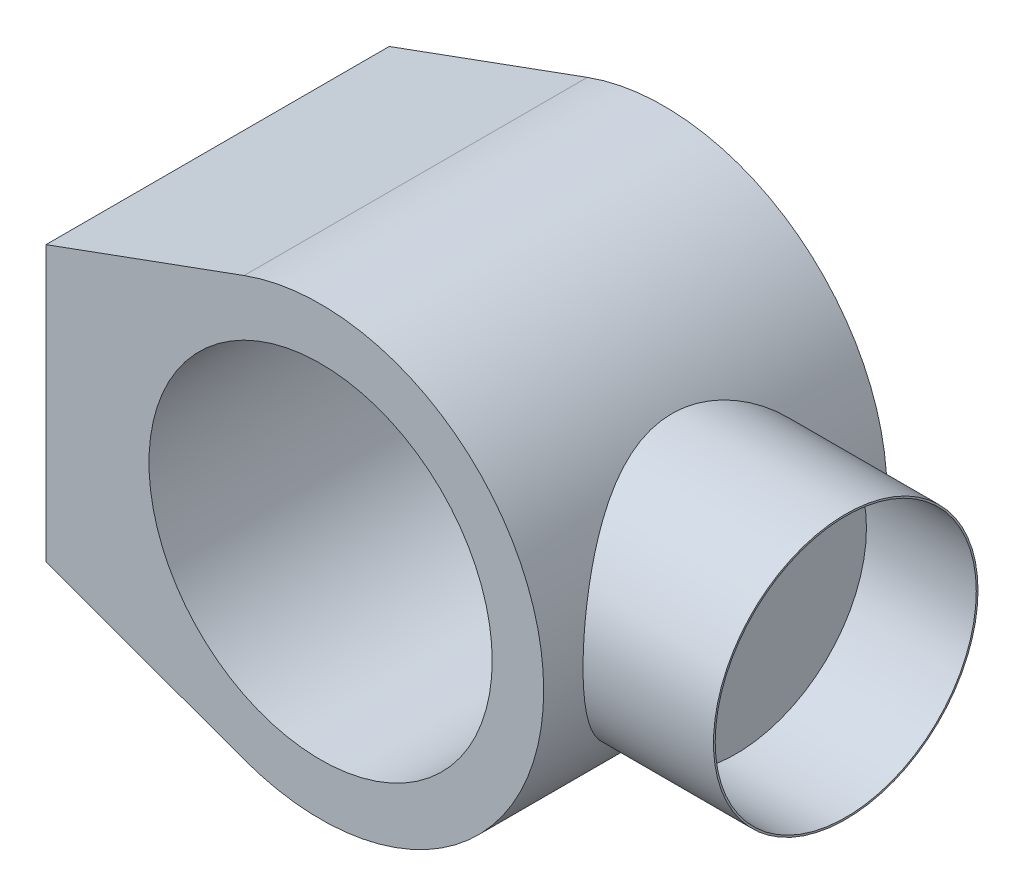
ISO-10303-21;
HEADER;
FILE_DESCRIPTION(('STEP AP214'),'2;1');
FILE_NAME('part.step','',(''),(''),'','','');
FILE_SCHEMA(('AUTOMOTIVE_DESIGN { 1 0 10303 214 1 1 1 1 }'));
ENDSEC;
DATA;
#1=APPLICATION_CONTEXT('core data for automotive mechanical design processes');
#2=APPLICATION_PROTOCOL_DEFINITION('international standard','automotive_design',2000,#1);
#3=PRODUCT_CONTEXT('',#1,'mechanical');
#4=PRODUCT('Part','Part','',(#3));
#5=PRODUCT_RELATED_PRODUCT_CATEGORY('part','',(#4));
#6=PRODUCT_DEFINITION_FORMATION('','',#4);
#7=PRODUCT_DEFINITION_CONTEXT('part definition',#1,'design');
#8=PRODUCT_DEFINITION('design','',#6,#7);
#9=PRODUCT_DEFINITION_SHAPE('','',#8);
#10=(LENGTH_UNIT() NAMED_UNIT(*) SI_UNIT(.MILLI.,.METRE.));
#11=(NAMED_UNIT(*) PLANE_ANGLE_UNIT() SI_UNIT($,.RADIAN.));
#12=(NAMED_UNIT(*) SI_UNIT($,.STERADIAN.) SOLID_ANGLE_UNIT());
#13=UNCERTAINTY_MEASURE_WITH_UNIT(LENGTH_MEASURE(1.E-05),#10,'distance_accuracy_value','');
#14=(GEOMETRIC_REPRESENTATION_CONTEXT(3) GLOBAL_UNCERTAINTY_ASSIGNED_CONTEXT((#13)) GLOBAL_UNIT_ASSIGNED_CONTEXT((#10,
#11,#12)) REPRESENTATION_CONTEXT('',''));
#15=CARTESIAN_POINT('',(0.,0.,0.));
#16=DIRECTION('',(0.,0.,1.));
#17=DIRECTION('',(1.,0.,0.));
#18=AXIS2_PLACEMENT_3D('',#15,#16,#17);
#19=CARTESIAN_POINT('',(0.,0.,50.));
#20=DIRECTION('',(0.,0.,1.));
#21=DIRECTION('',(1.,0.,0.));
#22=AXIS2_PLACEMENT_3D('',#19,#20,#21);
#23=PLANE('',#22);
#24=DIRECTION('',(0.939410286372225,-0.342794856813887,0.));
#25=VECTOR('',#24,1.);
#26=CARTESIAN_POINT('',(-80.,-40.,50.));
#27=LINE('',#26,#25);
#28=CARTESIAN_POINT('',(-80.,-40.,50.));
#29=VERTEX_POINT('',#28);
#30=CARTESIAN_POINT('',(-22.2816656929027,-61.0616686141946,50.));
#31=VERTEX_POINT('',#30);
#32=EDGE_CURVE('E289',#29,#31,#27,.T.);
#33=ORIENTED_EDGE('',*,*,#32,.T.);
#34=CARTESIAN_POINT('',(0.,0.,50.));
#35=DIRECTION('',(0.,0.,1.));
#36=DIRECTION('',(1.,0.,0.));
#37=AXIS2_PLACEMENT_3D('',#34,#35,#36);
#38=CIRCLE('',#37,65.);
#39=CARTESIAN_POINT('',(-22.2816656929027,61.0616686141947,50.));
#40=VERTEX_POINT('',#39);
#41=EDGE_CURVE('E284',#31,#40,#38,.T.);
#42=ORIENTED_EDGE('',*,*,#41,.T.);
#43=DIRECTION('',(-0.939410286372226,-0.342794856813887,0.));
#44=VECTOR('',#43,1.);
#45=CARTESIAN_POINT('',(-80.,40.,50.));
#46=LINE('',#45,#44);
#47=CARTESIAN_POINT('',(-80.,40.,50.));
#48=VERTEX_POINT('',#47);
#49=EDGE_CURVE('E287',#40,#48,#46,.T.);
#50=ORIENTED_EDGE('',*,*,#49,.T.);
#51=DIRECTION('',(0.,-1.,0.));
#52=VECTOR('',#51,1.);
#53=CARTESIAN_POINT('',(-80.,40.,50.));
#54=LINE('',#53,#52);
#55=EDGE_CURVE('E253',#48,#29,#54,.T.);
#56=ORIENTED_EDGE('',*,*,#55,.T.);
#57=EDGE_LOOP('',(#33,#42,#50,#56));
#58=FACE_BOUND('',#57,.T.);
#59=CARTESIAN_POINT('',(0.,0.,50.));
#60=DIRECTION('',(0.,0.,1.));
#61=DIRECTION('',(1.,0.,0.));
#62=AXIS2_PLACEMENT_3D('',#59,#60,#61);
#63=CIRCLE('',#62,50.);
#64=CARTESIAN_POINT('',(50.,0.,50.));
#65=VERTEX_POINT('',#64);
#66=EDGE_CURVE('E312',#65,#65,#63,.T.);
#67=ORIENTED_EDGE('',*,*,#66,.F.);
#68=EDGE_LOOP('',(#67));
#69=FACE_BOUND('',#68,.T.);
#70=ADVANCED_FACE('F234',(#58,#69),#23,.T.);
#71=CARTESIAN_POINT('',(0.,0.,-50.));
#72=DIRECTION('',(0.,0.,1.));
#73=DIRECTION('',(1.,0.,0.));
#74=AXIS2_PLACEMENT_3D('',#71,#72,#73);
#75=PLANE('',#74);
#76=DIRECTION('',(0.939410286372225,-0.342794856813887,0.));
#77=VECTOR('',#76,1.);
#78=CARTESIAN_POINT('',(-80.,-40.,-50.));
#79=LINE('',#78,#77);
#80=CARTESIAN_POINT('',(-80.,-40.,-50.));
#81=VERTEX_POINT('',#80);
#82=CARTESIAN_POINT('',(-22.2816656929027,-61.0616686141946,-50.));
#83=VERTEX_POINT('',#82);
#84=EDGE_CURVE('E308',#81,#83,#79,.T.);
#85=ORIENTED_EDGE('',*,*,#84,.F.);
#86=DIRECTION('',(0.,-1.,0.));
#87=VECTOR('',#86,1.);
#88=CARTESIAN_POINT('',(-80.,40.,-50.));
#89=LINE('',#88,#87);
#90=CARTESIAN_POINT('',(-80.,40.,-50.));
#91=VERTEX_POINT('',#90);
#92=EDGE_CURVE('E276',#91,#81,#89,.T.);
#93=ORIENTED_EDGE('',*,*,#92,.F.);
#94=DIRECTION('',(-0.939410286372226,-0.342794856813887,0.));
#95=VECTOR('',#94,1.);
#96=CARTESIAN_POINT('',(-80.,40.,-50.));
#97=LINE('',#96,#95);
#98=CARTESIAN_POINT('',(-22.2816656929027,61.0616686141947,-50.));
#99=VERTEX_POINT('',#98);
#100=EDGE_CURVE('E270',#99,#91,#97,.T.);
#101=ORIENTED_EDGE('',*,*,#100,.F.);
#102=CARTESIAN_POINT('',(0.,0.,-50.));
#103=DIRECTION('',(0.,0.,1.));
#104=DIRECTION('',(1.,0.,0.));
#105=AXIS2_PLACEMENT_3D('',#102,#103,#104);
#106=CIRCLE('',#105,65.);
#107=EDGE_CURVE('E295',#83,#99,#106,.T.);
#108=ORIENTED_EDGE('',*,*,#107,.F.);
#109=EDGE_LOOP('',(#85,#93,#101,#108));
#110=FACE_BOUND('',#109,.T.);
#111=CARTESIAN_POINT('',(0.,0.,-50.));
#112=DIRECTION('',(0.,0.,1.));
#113=DIRECTION('',(1.,0.,0.));
#114=AXIS2_PLACEMENT_3D('',#111,#112,#113);
#115=CIRCLE('',#114,50.);
#116=CARTESIAN_POINT('',(50.,0.,-50.));
#117=VERTEX_POINT('',#116);
#118=EDGE_CURVE('E404',#117,#117,#115,.T.);
#119=ORIENTED_EDGE('',*,*,#118,.T.);
#120=EDGE_LOOP('',(#119));
#121=FACE_BOUND('',#120,.T.);
#122=ADVANCED_FACE('F351',(#110,#121),#75,.F.);
#123=CARTESIAN_POINT('',(-80.,-40.,50.));
#124=DIRECTION('',(0.342794856813887,0.939410286372225,0.));
#125=DIRECTION('',(-0.939410286372225,0.342794856813887,0.));
#126=AXIS2_PLACEMENT_3D('',#123,#124,#125);
#127=PLANE('',#126);
#128=ORIENTED_EDGE('',*,*,#84,.T.);
#129=DIRECTION('',(0.,0.,-1.));
#130=VECTOR('',#129,1.);
#131=CARTESIAN_POINT('',(-22.2816656929027,-61.0616686141946,50.));
#132=LINE('',#131,#130);
#133=EDGE_CURVE('E297',#31,#83,#132,.T.);
#134=ORIENTED_EDGE('',*,*,#133,.F.);
#135=ORIENTED_EDGE('',*,*,#32,.F.);
#136=DIRECTION('',(0.,0.,-1.));
#137=VECTOR('',#136,1.);
#138=CARTESIAN_POINT('',(-80.,-40.,50.));
#139=LINE('',#138,#137);
#140=EDGE_CURVE('E304',#29,#81,#139,.T.);
#141=ORIENTED_EDGE('',*,*,#140,.T.);
#142=EDGE_LOOP('',(#128,#134,#135,#141));
#143=FACE_BOUND('',#142,.T.);
#144=ADVANCED_FACE('F236',(#143),#127,.F.);
#145=CARTESIAN_POINT('',(0.,0.,50.));
#146=DIRECTION('',(0.,0.,-1.));
#147=DIRECTION('',(-1.,0.,0.));
#148=AXIS2_PLACEMENT_3D('',#145,#146,#147);
#149=CYLINDRICAL_SURFACE('',#148,65.);
#150=CARTESIAN_POINT('',(65.,0.,-38.535));
#151=CARTESIAN_POINT('',(64.9999911949424,0.987976831353311,-38.5349902511514));
#152=CARTESIAN_POINT('',(64.9774152738882,1.97627275869706,-38.4969424597008));
#153=CARTESIAN_POINT('',(64.8876432189488,3.94543171340727,-38.3452225097814));
#154=CARTESIAN_POINT('',(64.8204190907879,4.92628968670687,-38.2315029052557));
#155=CARTESIAN_POINT('',(64.6428292345888,6.87486862388316,-37.9296260718127));
#156=CARTESIAN_POINT('',(64.5323640065708,7.84255392412636,-37.7412971509091));
#157=CARTESIAN_POINT('',(64.2710340997559,9.75530492921842,-37.2926969034477));
#158=CARTESIAN_POINT('',(64.1201753775438,10.7003739467875,-37.0324361840559));
#159=CARTESIAN_POINT('',(63.7824439438179,12.5573127748817,-36.4445325274687));
#160=CARTESIAN_POINT('',(63.5957538140062,13.4693241562554,-36.1172306583173));
#161=CARTESIAN_POINT('',(63.1900028197763,15.2599625528183,-35.3978935127097));
#162=CARTESIAN_POINT('',(62.9709408812313,16.1385884590296,-35.0058560882165));
#163=CARTESIAN_POINT('',(62.5051306064847,17.8578155326083,-34.1608224192051));
#164=CARTESIAN_POINT('',(62.258394169682,18.6984328263064,-33.7078523577501));
#165=CARTESIAN_POINT('',(61.7420488725879,20.3386024777687,-32.7443468133726));
#166=CARTESIAN_POINT('',(61.4724391569129,21.1381532979886,-32.2338091773819));
#167=CARTESIAN_POINT('',(60.8944485800029,22.752035334423,-31.1179179444586));
#168=CARTESIAN_POINT('',(60.5846772078036,23.5629321203387,-30.5083171571327));
#169=CARTESIAN_POINT('',(59.9512104449879,25.1310078287554,-29.2301554735673));
#170=CARTESIAN_POINT('',(59.6275144519006,25.888184423204,-28.5615920248973));
#171=CARTESIAN_POINT('',(58.9726752175314,27.347095337709,-27.1680220973247));
#172=CARTESIAN_POINT('',(58.6415235718192,28.0487626041554,-26.4429493931147));
#173=CARTESIAN_POINT('',(57.9793309358277,29.3931758548013,-24.940010876701));
#174=CARTESIAN_POINT('',(57.6482899523926,30.0359186942767,-24.1621422506953));
#175=CARTESIAN_POINT('',(56.9548534740239,31.332854524002,-22.4605244205008));
#176=CARTESIAN_POINT('',(56.59342401092,31.9792803253426,-21.5304385797799));
#177=CARTESIAN_POINT('',(55.8914135552976,33.1909683917639,-19.6110682249147));
#178=CARTESIAN_POINT('',(55.5508358856725,33.7562177399664,-18.6217743249282));
#179=CARTESIAN_POINT('',(54.9030315892671,34.7999137155156,-16.5896122167423));
#180=CARTESIAN_POINT('',(54.595762148095,35.2784723194759,-15.5468153851819));
#181=CARTESIAN_POINT('',(54.0266654398783,36.143990706523,-13.4120636687325));
#182=CARTESIAN_POINT('',(53.7648217458336,36.5309836203778,-12.3201267346954));
#183=CARTESIAN_POINT('',(53.3539859684097,37.1274886194685,-10.3578312103774));
#184=CARTESIAN_POINT('',(53.1929493804508,37.3573298419664,-9.49612757765819));
#185=CARTESIAN_POINT('',(52.9095509002482,37.7576449243597,-7.75279893885493));
#186=CARTESIAN_POINT('',(52.7871831120935,37.9281278351426,-6.87117699174275));
#187=CARTESIAN_POINT('',(52.585424148517,38.2073674275062,-5.09424243371309));
#188=CARTESIAN_POINT('',(52.5059890550397,38.3161871930235,-4.19894478038054));
#189=CARTESIAN_POINT('',(52.3928244581682,38.470783862046,-2.39999272392233));
#190=CARTESIAN_POINT('',(52.3590957784487,38.5165596294362,-1.49633817049252));
#191=CARTESIAN_POINT('',(52.3386250056153,38.5443725132486,0.314119950689428));
#192=CARTESIAN_POINT('',(52.3519676509242,38.5262946795012,1.22092625870764));
#193=CARTESIAN_POINT('',(52.425309688552,38.4264320661922,3.02910272984153));
#194=CARTESIAN_POINT('',(52.4853092987791,38.3446469890902,3.93047286754814));
#195=CARTESIAN_POINT('',(52.6497496558937,38.1185427067294,5.72175599350346));
#196=CARTESIAN_POINT('',(52.7542183455826,37.9741841814769,6.61166141487832));
#197=CARTESIAN_POINT('',(53.0038756591501,37.624926610728,8.37364296759673));
#198=CARTESIAN_POINT('',(53.1490652346887,37.4200261503412,9.24571868174327));
#199=CARTESIAN_POINT('',(53.4736705035497,36.9546485442773,10.9580619180162));
#200=CARTESIAN_POINT('',(53.6527074780226,36.6947829052219,11.7985684806562));
#201=CARTESIAN_POINT('',(54.0407872995581,36.1208142055593,13.453633748011));
#202=CARTESIAN_POINT('',(54.249829638269,35.8067120638101,14.2681928920421));
#203=CARTESIAN_POINT('',(54.6925622377679,35.1267444450613,15.8686557781167));
#204=CARTESIAN_POINT('',(54.9262580449052,34.7608673137721,16.6545530182791));
#205=CARTESIAN_POINT('',(55.4128738742391,33.979775448213,18.1952523282263));
#206=CARTESIAN_POINT('',(55.6657954137918,33.5645568182948,18.9500519364224));
#207=CARTESIAN_POINT('',(56.2301672857619,32.6117313991161,20.5531810573438));
#208=CARTESIAN_POINT('',(56.5442222783176,32.0653433324212,21.3953855691914));
#209=CARTESIAN_POINT('',(57.1835162711493,30.9108544286079,23.0318967649082));
#210=CARTESIAN_POINT('',(57.5087562291142,30.3027482982696,23.826199331161));
#211=CARTESIAN_POINT('',(58.1631348258033,29.0269543811981,25.3649714268417));
#212=CARTESIAN_POINT('',(58.4922765320987,28.3592165874688,26.1093981974321));
#213=CARTESIAN_POINT('',(59.1470182420437,26.9670549755447,27.5449452888638));
#214=CARTESIAN_POINT('',(59.4726180550154,26.2426281225284,28.2360627518788));
#215=CARTESIAN_POINT('',(60.1560116268375,24.6396150029807,29.6500315716697));
#216=CARTESIAN_POINT('',(60.512336842441,23.7533334216756,30.3649040735003));
#217=CARTESIAN_POINT('',(61.2021030720994,21.9149829069974,31.7172172151811));
#218=CARTESIAN_POINT('',(61.5355417542829,20.9629072897518,32.3546499699018));
#219=CARTESIAN_POINT('',(62.1702161885582,18.9981418968875,33.5460286932068));
#220=CARTESIAN_POINT('',(62.471464630969,17.9854762550367,34.1000075972592));
#221=CARTESIAN_POINT('',(63.033180262524,15.9052910760494,35.1184927464048));
#222=CARTESIAN_POINT('',(63.2936525345319,14.8377783978186,35.5830101447897));
#223=CARTESIAN_POINT('',(63.7505229620954,12.7263777457139,36.3892618404304));
#224=CARTESIAN_POINT('',(63.9499815589726,11.6854496494908,36.7370064395608));
#225=CARTESIAN_POINT('',(64.3005658226089,9.57006954796787,37.3439479527016));
#226=CARTESIAN_POINT('',(64.4516929865986,8.49561858228491,37.60314760971));
#227=CARTESIAN_POINT('',(64.7009095521158,6.32346568867483,38.0287216155453));
#228=CARTESIAN_POINT('',(64.7990493321286,5.22578688071405,38.1951841402899));
#229=CARTESIAN_POINT('',(64.9393877775687,3.01666035850831,38.4327935417035));
#230=CARTESIAN_POINT('',(64.9815938780368,1.9052144940919,38.5039530866307));
#231=CARTESIAN_POINT('',(65.0069469332665,-0.172962373037184,38.5467167764841));
#232=CARTESIAN_POINT('',(64.9971680793765,-1.13938702649722,38.5302455835157));
#233=CARTESIAN_POINT('',(64.9347674364242,-3.06681472572754,38.424889182589));
#234=CARTESIAN_POINT('',(64.8821502070854,-4.02781833755292,38.336011681569));
#235=CARTESIAN_POINT('',(64.7353523384021,-5.93727243395648,38.0870337039576));
#236=CARTESIAN_POINT('',(64.6411726523484,-6.88572320593708,37.926934860923));
#237=CARTESIAN_POINT('',(64.4134755856428,-8.76348661994124,37.5375410984916));
#238=CARTESIAN_POINT('',(64.2799571652862,-9.69279875544484,37.3082443502222));
#239=CARTESIAN_POINT('',(63.9797530559851,-11.5073685588892,36.7885719627438));
#240=CARTESIAN_POINT('',(63.8138087666919,-12.3931396073621,36.4995545779764));
#241=CARTESIAN_POINT('',(63.4505545973374,-14.1357468665415,35.8606767818825));
#242=CARTESIAN_POINT('',(63.2532455817741,-14.9925838739607,35.5108180474855));
#243=CARTESIAN_POINT('',(62.8311229814591,-16.6733600456623,34.7533470425395));
#244=CARTESIAN_POINT('',(62.6063067578894,-17.497296043617,34.3457292304598));
#245=CARTESIAN_POINT('',(62.13338151108,-19.1088533110999,33.4759098638419));
#246=CARTESIAN_POINT('',(61.8852710483267,-19.8964723318577,33.0137049355288));
#247=CARTESIAN_POINT('',(61.3433602974475,-21.5126028675456,31.9869286213026));
#248=CARTESIAN_POINT('',(61.0474924496615,-22.336835493304,31.4167096882254));
#249=CARTESIAN_POINT('',(60.4389614761619,-23.93455429077,30.2172370252016));
#250=CARTESIAN_POINT('',(60.1262973678833,-24.7080374877924,29.5879798399631));
#251=CARTESIAN_POINT('',(59.4902751451785,-26.202428832304,28.273141132615));
#252=CARTESIAN_POINT('',(59.166905938001,-26.9232797949273,27.587500019294));
#253=CARTESIAN_POINT('',(58.5165022607872,-28.3090968942259,26.1634949973498));
#254=CARTESIAN_POINT('',(58.1894676135919,-28.9740603164152,25.4251285310475));
#255=CARTESIAN_POINT('',(57.4977754958128,-30.325769571008,23.8022084907858));
#256=CARTESIAN_POINT('',(57.1335637045106,-31.0047220663502,22.9109524486797));
#257=CARTESIAN_POINT('',(56.4199743194738,-32.2850401574689,21.0684847655453));
#258=CARTESIAN_POINT('',(56.070599063944,-32.8863935540226,20.1172637324254));
#259=CARTESIAN_POINT('',(55.3983851108793,-34.0065475327486,18.1596135414526));
#260=CARTESIAN_POINT('',(55.0755227704455,-34.5254220605492,17.1532349358583));
#261=CARTESIAN_POINT('',(54.4680273628646,-35.4760823807614,15.089194818302));
#262=CARTESIAN_POINT('',(54.1833825688909,-35.9078949081258,14.0315491735231));
#263=CARTESIAN_POINT('',(53.7205950366889,-36.5954960085083,12.1047197376352));
#264=CARTESIAN_POINT('',(53.5327308586644,-36.8691574322931,11.2442162752271));
#265=CARTESIAN_POINT('',(53.1936119065039,-37.35676634061,9.49938852608433));
#266=CARTESIAN_POINT('',(53.0423521450732,-37.5707219605735,8.61506750272139));
#267=CARTESIAN_POINT('',(52.781652512638,-37.9360991744812,6.82853516326083));
#268=CARTESIAN_POINT('',(52.6721654193987,-38.0875913963901,5.92634526859163));
#269=CARTESIAN_POINT('',(52.4987672374539,-38.3262484778434,4.1090907296477));
#270=CARTESIAN_POINT('',(52.4348565311965,-38.4134127975892,3.19402597740104));
#271=CARTESIAN_POINT('',(52.3549677413944,-38.5222273797041,1.35483975428445));
#272=CARTESIAN_POINT('',(52.3391494122421,-38.543659292683,0.430698306644773));
#273=CARTESIAN_POINT('',(52.3565355388121,-38.5200387303254,-1.41626769469411));
#274=CARTESIAN_POINT('',(52.3897401243943,-38.474986078874,-2.33909224489842));
#275=CARTESIAN_POINT('',(52.5038703449959,-38.3190923556067,-4.17661321974098));
#276=CARTESIAN_POINT('',(52.5848199299263,-38.2082182661701,-5.09130533106577));
#277=CARTESIAN_POINT('',(52.791349386482,-37.9223468202672,-6.90544254589293));
#278=CARTESIAN_POINT('',(52.9169296178298,-37.7473489469638,-7.80488752644245));
#279=CARTESIAN_POINT('',(53.2023861828065,-37.3438684628,-9.54720988231049));
#280=CARTESIAN_POINT('',(53.360689161589,-37.1178061243641,-10.3909106476192));
#281=CARTESIAN_POINT('',(53.709514483391,-36.6112349072273,-12.0548775666491));
#282=CARTESIAN_POINT('',(53.9000356504713,-36.3307280156555,-12.8751445744076));
#283=CARTESIAN_POINT('',(54.3081955438559,-35.7177188917479,-14.4891788837883));
#284=CARTESIAN_POINT('',(54.5258399785147,-35.3852057104163,-15.2829405623865));
#285=CARTESIAN_POINT('',(54.9830147548226,-34.6705630384109,-16.8414141395256));
#286=CARTESIAN_POINT('',(55.2225478235101,-34.2884273629172,-17.6061224015411));
#287=CARTESIAN_POINT('',(55.6135053276522,-33.6483790725803,-18.7876235738843));
#288=CARTESIAN_POINT('',(55.7593888213826,-33.4062109256189,-19.2148828398224));
#289=CARTESIAN_POINT('',(56.0557259084272,-32.906533837033,-20.0585787093483));
#290=CARTESIAN_POINT('',(56.2061785844451,-32.6490279647186,-20.4750174544887));
#291=CARTESIAN_POINT('',(56.6630598112528,-31.8539042823748,-21.7078668433497));
#292=CARTESIAN_POINT('',(56.9750122968427,-31.2936792139708,-22.5078128390879));
#293=CARTESIAN_POINT('',(57.6064987610449,-30.1154188416892,-24.061571703847));
#294=CARTESIAN_POINT('',(57.9260379383009,-29.4973429902626,-24.8153515935825));
#295=CARTESIAN_POINT('',(58.565695213028,-28.206002730897,-26.2738722465142));
#296=CARTESIAN_POINT('',(58.8858133441619,-27.532735005908,-26.9786100575521));
#297=CARTESIAN_POINT('',(59.5688114462661,-26.0257908961314,-28.440624618795));
#298=CARTESIAN_POINT('',(59.9307136176125,-25.1833546830858,-29.1893637246979));
#299=CARTESIAN_POINT('',(60.6370735775391,-23.4315472595737,-30.6134473222753));
#300=CARTESIAN_POINT('',(60.9815292976103,-22.5221681433478,-31.2887831218376));
#301=CARTESIAN_POINT('',(61.6439525670666,-20.6402135959124,-32.5609913694733));
#302=CARTESIAN_POINT('',(61.9619082166694,-19.6676101191993,-33.1578286367998));
#303=CARTESIAN_POINT('',(62.5623228419974,-17.6648942069813,-34.2667145263033));
#304=CARTESIAN_POINT('',(62.8447866431246,-16.6347896167785,-34.7787746776241));
#305=CARTESIAN_POINT('',(63.3560797465706,-14.5636577811176,-35.6942257492012));
#306=CARTESIAN_POINT('',(63.586546296721,-13.5245526080168,-36.101021900906));
#307=CARTESIAN_POINT('',(63.8969369605214,-11.936218017771,-36.6440529178905));
#308=CARTESIAN_POINT('',(63.9945368289996,-11.4016814715244,-36.8139054798722));
#309=CARTESIAN_POINT('',(64.1772440442244,-10.3237549532887,-37.1306028503439));
#310=CARTESIAN_POINT('',(64.2623530227239,-9.78036614804074,-37.2774506642385));
#311=CARTESIAN_POINT('',(64.4191624425642,-8.68764891413363,-37.5471263319596));
#312=CARTESIAN_POINT('',(64.4909051953814,-8.13834525866304,-37.670030040549));
#313=CARTESIAN_POINT('',(64.6207451973013,-7.03339600238696,-37.8918860754462));
#314=CARTESIAN_POINT('',(64.6788443382848,-6.47775129207666,-37.9908417225512));
#315=CARTESIAN_POINT('',(64.7809010590083,-5.36177242416769,-38.1643326145989));
#316=CARTESIAN_POINT('',(64.8248684552073,-4.80144180039433,-38.238884811792));
#317=CARTESIAN_POINT('',(64.898347964846,-3.67718554443427,-38.3633199760748));
#318=CARTESIAN_POINT('',(64.927862482216,-3.11326052591665,-38.4132070456996));
#319=CARTESIAN_POINT('',(64.9666609614405,-2.12436499278918,-38.4787443154014));
#320=CARTESIAN_POINT('',(64.9791568068887,-1.69987253189846,-38.4998339267692));
#321=CARTESIAN_POINT('',(64.9958283145778,-0.850273087843481,-38.5279640251572));
#322=CARTESIAN_POINT('',(65.0000037891698,-0.425166091035992,-38.5350041953209));
#323=CARTESIAN_POINT('',(65.,0.,-38.535));
#324=B_SPLINE_CURVE_WITH_KNOTS('',3,(#150,#151,#152,#153,#154,#155,#156,#157,#158,#159,#160,
#161,#162,#163,#164,#165,#166,#167,#168,#169,#170,#171,#172,#173,#174,#175,#176,#177,#178,#179,
#180,#181,#182,#183,#184,#185,#186,#187,#188,#189,#190,#191,#192,#193,#194,#195,#196,#197,#198,
#199,#200,#201,#202,#203,#204,#205,#206,#207,#208,#209,#210,#211,#212,#213,#214,#215,#216,#217,
#218,#219,#220,#221,#222,#223,#224,#225,#226,#227,#228,#229,#230,#231,#232,#233,#234,#235,#236,
#237,#238,#239,#240,#241,#242,#243,#244,#245,#246,#247,#248,#249,#250,#251,#252,#253,#254,#255,
#256,#257,#258,#259,#260,#261,#262,#263,#264,#265,#266,#267,#268,#269,#270,#271,#272,#273,#274,
#275,#276,#277,#278,#279,#280,#281,#282,#283,#284,#285,#286,#287,#288,#289,#290,#291,#292,#293,
#294,#295,#296,#297,#298,#299,#300,#301,#302,#303,#304,#305,#306,#307,#308,#309,#310,#311,#312,
#313,#314,#315,#316,#317,#318,#319,#320,#321,#322,#323),.UNSPECIFIED.,.T.,.F.,(4,2,2,2,2,2,2,2,
2,2,2,2,2,2,2,2,2,2,2,2,2,2,2,2,2,2,2,2,2,2,2,2,2,2,2,2,2,2,2,2,2,2,2,2,2,2,2,2,2,2,2,2,2,2,2,2,
2,2,2,2,2,2,2,2,2,2,2,2,2,2,2,2,2,2,2,2,2,2,2,2,2,2,2,2,2,2,4),(0.,2.96350118442673,
5.92886223045346,8.90108721808222,11.8728741507873,14.8299019314972,17.7870278511915,
20.7428871139721,23.6988569646846,26.8777990659305,30.0568788477888,33.2397420159151,
36.4227749507614,39.9852152021957,43.5482216860811,47.1065925726253,50.663673975512,
53.379701713662,56.0953151334605,58.8081453297794,61.5210244133276,64.2387897478915,
66.9565677756694,69.6760560861517,72.3956079572372,75.0863611208314,77.7770687029905,
80.468382916162,83.159909757416,86.3124636387378,89.4652881261687,92.6207818494451,
95.7764446162718,99.3512766368651,102.926472352218,106.500253381795,110.073588574236,
113.415115475689,116.756538851944,120.094779704386,123.432576773271,126.328824271085,
129.224763532154,132.120636374404,135.016585760105,137.852766711298,140.688869503112,
143.525244581224,146.361795054276,149.493642417523,152.625673190764,155.761057778205,
158.896594564956,162.426799272065,165.957558282307,169.485133750443,173.011624317179,
175.775833980465,178.539666812197,181.300365924455,184.061088202474,186.830971147859,
189.600861430566,192.37214233247,195.143445571363,197.803860284357,200.464177915212,
203.125056384232,205.786266817169,207.322913555712,208.85925381453,211.931926529589,
215.006769239152,218.081796883463,221.628788012645,225.176198705111,228.725193864892,
232.273705986954,235.686599348629,237.393950891415,239.101079194665,240.802708098208,
242.504100907204,244.20430929553,245.904234794044,247.179519556858,248.454833080797),.UNSPECIFIED.);
#325=CARTESIAN_POINT('',(65.,0.,-38.535));
#326=VERTEX_POINT('',#325);
#327=EDGE_CURVE('E390',#326,#326,#324,.T.);
#328=ORIENTED_EDGE('',*,*,#327,.F.);
#329=EDGE_LOOP('',(#328));
#330=FACE_BOUND('',#329,.T.);
#331=ORIENTED_EDGE('',*,*,#107,.T.);
#332=DIRECTION('',(0.,0.,-1.));
#333=VECTOR('',#332,1.);
#334=CARTESIAN_POINT('',(-22.2816656929027,61.0616686141947,50.));
#335=LINE('',#334,#333);
#336=EDGE_CURVE('E293',#40,#99,#335,.T.);
#337=ORIENTED_EDGE('',*,*,#336,.F.);
#338=ORIENTED_EDGE('',*,*,#41,.F.);
#339=ORIENTED_EDGE('',*,*,#133,.T.);
#340=EDGE_LOOP('',(#331,#337,#338,#339));
#341=FACE_BOUND('',#340,.T.);
#342=ADVANCED_FACE('F294',(#330,#341),#149,.T.);
#343=CARTESIAN_POINT('',(-80.,40.,50.));
#344=DIRECTION('',(0.342794856813887,-0.939410286372225,0.));
#345=DIRECTION('',(0.939410286372225,0.342794856813887,0.));
#346=AXIS2_PLACEMENT_3D('',#343,#344,#345);
#347=PLANE('',#346);
#348=ORIENTED_EDGE('',*,*,#100,.T.);
#349=DIRECTION('',(0.,0.,-1.));
#350=VECTOR('',#349,1.);
#351=CARTESIAN_POINT('',(-80.,40.,50.));
#352=LINE('',#351,#350);
#353=EDGE_CURVE('E298',#48,#91,#352,.T.);
#354=ORIENTED_EDGE('',*,*,#353,.F.);
#355=ORIENTED_EDGE('',*,*,#49,.F.);
#356=ORIENTED_EDGE('',*,*,#336,.T.);
#357=EDGE_LOOP('',(#348,#354,#355,#356));
#358=FACE_BOUND('',#357,.T.);
#359=ADVANCED_FACE('F300',(#358),#347,.F.);
#360=CARTESIAN_POINT('',(-80.,40.,50.));
#361=DIRECTION('',(1.,0.,0.));
#362=DIRECTION('',(0.,1.,0.));
#363=AXIS2_PLACEMENT_3D('',#360,#361,#362);
#364=PLANE('',#363);
#365=ORIENTED_EDGE('',*,*,#92,.T.);
#366=ORIENTED_EDGE('',*,*,#140,.F.);
#367=ORIENTED_EDGE('',*,*,#55,.F.);
#368=ORIENTED_EDGE('',*,*,#353,.T.);
#369=EDGE_LOOP('',(#365,#366,#367,#368));
#370=FACE_BOUND('',#369,.T.);
#371=ADVANCED_FACE('F347',(#370),#364,.F.);
#372=CARTESIAN_POINT('',(0.,0.,50.));
#373=DIRECTION('',(0.,0.,-1.));
#374=DIRECTION('',(-1.,0.,0.));
#375=AXIS2_PLACEMENT_3D('',#372,#373,#374);
#376=CYLINDRICAL_SURFACE('',#375,50.);
#377=ORIENTED_EDGE('',*,*,#66,.T.);
#378=EDGE_LOOP('',(#377));
#379=FACE_BOUND('',#378,.T.);
#380=ORIENTED_EDGE('',*,*,#118,.F.);
#381=EDGE_LOOP('',(#380));
#382=FACE_BOUND('',#381,.T.);
#383=ADVANCED_FACE('F341',(#379,#382),#376,.F.);
#384=CARTESIAN_POINT('',(103.,0.,0.));
#385=DIRECTION('',(1.,0.,0.));
#386=DIRECTION('',(0.,0.,-1.));
#387=AXIS2_PLACEMENT_3D('',#384,#385,#386);
#388=PLANE('',#387);
#389=CARTESIAN_POINT('',(103.,0.,0.));
#390=DIRECTION('',(1.,0.,0.));
#391=DIRECTION('',(0.,0.,-1.));
#392=AXIS2_PLACEMENT_3D('',#389,#390,#391);
#393=CIRCLE('',#392,38.035);
#394=CARTESIAN_POINT('',(103.,0.,-38.035));
#395=VERTEX_POINT('',#394);
#396=EDGE_CURVE('E398',#395,#395,#393,.T.);
#397=ORIENTED_EDGE('',*,*,#396,.F.);
#398=EDGE_LOOP('',(#397));
#399=FACE_BOUND('',#398,.T.);
#400=CARTESIAN_POINT('',(103.,0.,0.));
#401=DIRECTION('',(1.,0.,0.));
#402=DIRECTION('',(0.,0.,-1.));
#403=AXIS2_PLACEMENT_3D('',#400,#401,#402);
#404=CIRCLE('',#403,38.535);
#405=CARTESIAN_POINT('',(103.,0.,-38.535));
#406=VERTEX_POINT('',#405);
#407=EDGE_CURVE('E407',#406,#406,#404,.T.);
#408=ORIENTED_EDGE('',*,*,#407,.T.);
#409=EDGE_LOOP('',(#408));
#410=FACE_BOUND('',#409,.T.);
#411=ADVANCED_FACE('F346',(#399,#410),#388,.T.);
#412=CARTESIAN_POINT('',(-80.002,0.,0.));
#413=DIRECTION('',(1.,0.,0.));
#414=DIRECTION('',(0.,0.,-1.));
#415=AXIS2_PLACEMENT_3D('',#412,#413,#414);
#416=CYLINDRICAL_SURFACE('',#415,38.535);
#417=ORIENTED_EDGE('',*,*,#407,.F.);
#418=EDGE_LOOP('',(#417));
#419=FACE_BOUND('',#418,.T.);
#420=ORIENTED_EDGE('',*,*,#327,.T.);
#421=EDGE_LOOP('',(#420));
#422=FACE_BOUND('',#421,.T.);
#423=ADVANCED_FACE('F338',(#419,#422),#416,.T.);
#424=CARTESIAN_POINT('',(-80.002,0.,0.));
#425=DIRECTION('',(1.,0.,0.));
#426=DIRECTION('',(0.,0.,-1.));
#427=AXIS2_PLACEMENT_3D('',#424,#425,#426);
#428=CYLINDRICAL_SURFACE('',#427,38.035);
#429=CARTESIAN_POINT('',(71.,0.,0.));
#430=DIRECTION('',(1.,0.,0.));
#431=DIRECTION('',(0.,0.,-1.));
#432=AXIS2_PLACEMENT_3D('',#429,#430,#431);
#433=CIRCLE('',#432,38.035);
#434=CARTESIAN_POINT('',(71.,0.,-38.035));
#435=VERTEX_POINT('',#434);
#436=EDGE_CURVE('E399',#435,#435,#433,.T.);
#437=ORIENTED_EDGE('',*,*,#436,.F.);
#438=EDGE_LOOP('',(#437));
#439=FACE_BOUND('',#438,.T.);
#440=ORIENTED_EDGE('',*,*,#396,.T.);
#441=EDGE_LOOP('',(#440));
#442=FACE_BOUND('',#441,.T.);
#443=ADVANCED_FACE('F332',(#439,#442),#428,.F.);
#444=CARTESIAN_POINT('',(71.,0.,0.));
#445=DIRECTION('',(1.,0.,0.));
#446=DIRECTION('',(0.,0.,-1.));
#447=AXIS2_PLACEMENT_3D('',#444,#445,#446);
#448=PLANE('',#447);
#449=ORIENTED_EDGE('',*,*,#436,.T.);
#450=EDGE_LOOP('',(#449));
#451=FACE_BOUND('',#450,.T.);
#452=ADVANCED_FACE('F337',(#451),#448,.T.);
#453=CLOSED_SHELL('',(#70,#122,#144,#342,#359,#371,#383,#411,#423,#443,#452));
#454=CARTESIAN_POINT('',(68.,0.,0.));
#455=DIRECTION('',(1.,0.,0.));
#456=DIRECTION('',(0.,0.,-1.));
#457=AXIS2_PLACEMENT_3D('',#454,#455,#456);
#458=PLANE('',#457);
#459=CARTESIAN_POINT('',(68.,0.,0.));
#460=DIRECTION('',(1.,0.,0.));
#461=DIRECTION('',(0.,0.,-1.));
#462=AXIS2_PLACEMENT_3D('',#459,#460,#461);
#463=CIRCLE('',#462,38.035);
#464=CARTESIAN_POINT('',(68.,0.,-38.035));
#465=VERTEX_POINT('',#464);
#466=EDGE_CURVE('E12',#465,#465,#463,.F.);
#467=ORIENTED_EDGE('',*,*,#466,.T.);
#468=EDGE_LOOP('',(#467));
#469=FACE_BOUND('',#468,.T.);
#470=ADVANCED_FACE('F368',(#469),#458,.F.);
#471=CARTESIAN_POINT('',(65.,0.,-38.035));
#472=CARTESIAN_POINT('',(64.9999923392851,-0.977154430693574,-38.0349914919489));
#473=CARTESIAN_POINT('',(64.9779060460667,-1.954680747794,-37.9972805669894));
#474=CARTESIAN_POINT('',(64.8900824222465,-3.90241516293377,-37.8468973813591));
#475=CARTESIAN_POINT('',(64.8243157378537,-4.87261789570465,-37.7341747117217));
#476=CARTESIAN_POINT('',(64.6505672318478,-6.80020030637102,-37.4349028409359));
#477=CARTESIAN_POINT('',(64.5424824068693,-7.7575427562889,-37.24817349205));
#478=CARTESIAN_POINT('',(64.2867919547405,-9.6498713944958,-36.8033412294744));
#479=CARTESIAN_POINT('',(64.1391926352476,-10.5848611250005,-36.5452497070385));
#480=CARTESIAN_POINT('',(63.8087753392266,-12.4220402645132,-35.9621803298509));
#481=CARTESIAN_POINT('',(63.626135279014,-13.3243691046077,-35.6375398246347));
#482=CARTESIAN_POINT('',(63.2292239343072,-15.0960080722167,-34.9239727805895));
#483=CARTESIAN_POINT('',(63.0149515029114,-15.9653170010835,-34.5350439107822));
#484=CARTESIAN_POINT('',(62.5593982946298,-17.6662555651901,-33.6966366112118));
#485=CARTESIAN_POINT('',(62.3181302683511,-18.4979027303368,-33.2471867465926));
#486=CARTESIAN_POINT('',(61.8133257421786,-20.1205077589124,-32.2910713267907));
#487=CARTESIAN_POINT('',(61.5497884342724,-20.9114641442518,-31.7844036953099));
#488=CARTESIAN_POINT('',(60.9852620401258,-22.5070235471806,-30.6774620226618));
#489=CARTESIAN_POINT('',(60.6829451715539,-23.308272241205,-30.0730297614349));
#490=CARTESIAN_POINT('',(60.0649504006292,-24.8575425541567,-28.8056521626121));
#491=CARTESIAN_POINT('',(59.7492719236775,-25.6055618803065,-28.1427043072943));
#492=CARTESIAN_POINT('',(59.1109456501747,-27.046586025585,-26.7608130869078));
#493=CARTESIAN_POINT('',(58.7882901148367,-27.7395253005514,-26.0418049676507));
#494=CARTESIAN_POINT('',(58.1434465246993,-29.0668912954434,-24.5514350307281));
#495=CARTESIAN_POINT('',(57.8212584951825,-29.7013149590374,-23.7800704820801));
#496=CARTESIAN_POINT('',(57.1480385873437,-30.9787221753103,-22.0957541464497));
#497=CARTESIAN_POINT('',(56.7979693681219,-31.6142429710797,-21.1767360655403));
#498=CARTESIAN_POINT('',(56.1185900180632,-32.8050912114315,-19.2805782730181));
#499=CARTESIAN_POINT('',(55.7892830645956,-33.360406398391,-18.3034297096187));
#500=CARTESIAN_POINT('',(55.1635113396593,-34.3852754872363,-16.2966784992409));
#501=CARTESIAN_POINT('',(54.8670050042875,-34.8549384262366,-15.2671447068546));
#502=CARTESIAN_POINT('',(54.31845948884,-35.7037913188979,-13.1601407324594));
#503=CARTESIAN_POINT('',(54.066404776841,-36.0830128902261,-12.0826874595167));
#504=CARTESIAN_POINT('',(53.6702535324729,-36.6687640943888,-10.1410336621337));
#505=CARTESIAN_POINT('',(53.5146684697728,-36.8949499470389,-9.28506297759516));
#506=CARTESIAN_POINT('',(53.2415818910122,-37.2879524555278,-7.55363920647797));
#507=CARTESIAN_POINT('',(53.1240746458456,-37.4547780429544,-6.67818907193696));
#508=CARTESIAN_POINT('',(52.9312615933397,-37.7267732512324,-4.91401718162156));
#509=CARTESIAN_POINT('',(52.8559143775193,-37.8320033742436,-4.02530933136878));
#510=CARTESIAN_POINT('',(52.7499988458543,-37.9795464881396,-2.23997657281297));
#511=CARTESIAN_POINT('',(52.7194313717001,-38.0218582963977,-1.34335151601501));
#512=CARTESIAN_POINT('',(52.7042315622659,-38.0429252347353,0.452504453666369));
#513=CARTESIAN_POINT('',(52.719674292724,-38.0215765024712,1.35173723108744));
#514=CARTESIAN_POINT('',(52.796064241736,-37.915429770997,3.14448098248979));
#515=CARTESIAN_POINT('',(52.8570116621006,-37.8306314903916,4.03799193107736));
#516=CARTESIAN_POINT('',(53.0221842870667,-37.5987783245207,5.81335495093389));
#517=CARTESIAN_POINT('',(53.1264359961032,-37.4516853106187,6.69519954013143));
#518=CARTESIAN_POINT('',(53.3745435015728,-37.0972339713765,8.44096687986464));
#519=CARTESIAN_POINT('',(53.5184002335947,-36.8898742223497,9.30488920650449));
#520=CARTESIAN_POINT('',(53.8397410678625,-36.419262342606,11.0031251033465));
#521=CARTESIAN_POINT('',(54.0169441551271,-36.1564752182941,11.8376214724609));
#522=CARTESIAN_POINT('',(54.400598870203,-35.5766159207253,13.48052489805));
#523=CARTESIAN_POINT('',(54.6070500551033,-35.2595445694925,14.2889323493679));
#524=CARTESIAN_POINT('',(55.0439168145052,-34.5735812700984,15.8769330540477));
#525=CARTESIAN_POINT('',(55.2743379446276,-34.2046773014821,16.6565195704502));
#526=CARTESIAN_POINT('',(55.7537866679708,-33.4174754667517,18.1843953860959));
#527=CARTESIAN_POINT('',(56.0028157137127,-32.9991737432002,18.9326822349824));
#528=CARTESIAN_POINT('',(56.5571261525341,-32.0413271146451,20.5185359078805));
#529=CARTESIAN_POINT('',(56.8648462575885,-31.4932076885089,21.35008240832));
#530=CARTESIAN_POINT('',(57.4907240464342,-30.3356168228167,22.9651673323307));
#531=CARTESIAN_POINT('',(57.8088826123457,-29.7261401891149,23.7487016824242));
#532=CARTESIAN_POINT('',(58.4484568236667,-28.4480037882065,25.2657234701866));
#533=CARTESIAN_POINT('',(58.7698749377027,-27.7792956505658,25.9991691218866));
#534=CARTESIAN_POINT('',(59.4086360008797,-26.3856335228267,27.412490163798));
#535=CARTESIAN_POINT('',(59.7259787421046,-25.6606766762292,28.092362829854));
#536=CARTESIAN_POINT('',(60.389100760686,-24.0623371337039,29.4774420649357));
#537=CARTESIAN_POINT('',(60.7334326543166,-23.1817570571576,30.1750689966954));
#538=CARTESIAN_POINT('',(61.3990869517175,-21.3564024769328,31.4933771108029));
#539=CARTESIAN_POINT('',(61.7204071042343,-20.411621710032,32.114050769094));
#540=CARTESIAN_POINT('',(62.3309999850557,-18.4631567440606,33.2724654307009));
#541=CARTESIAN_POINT('',(62.6202862220208,-17.4594976491554,33.8102414296506));
#542=CARTESIAN_POINT('',(63.1585371877222,-15.3991021656832,34.797027269234));
#543=CARTESIAN_POINT('',(63.4075069475024,-14.3423724213326,35.2460481870511));
#544=CARTESIAN_POINT('',(63.8424767991298,-12.255503755709,36.0224846046978));
#545=CARTESIAN_POINT('',(64.0315670558329,-11.228283776271,36.3560088283696));
#546=CARTESIAN_POINT('',(64.3625556067959,-9.14201974928494,36.9358436130783));
#547=CARTESIAN_POINT('',(64.5044554655672,-8.08297675803999,37.1821570654463));
#548=CARTESIAN_POINT('',(64.7366689435213,-5.9431332682974,37.5835646157414));
#549=CARTESIAN_POINT('',(64.8270290770282,-4.86235330235907,37.7387409681772));
#550=CARTESIAN_POINT('',(64.9535046537498,-2.68834631359064,37.9555906255113));
#551=CARTESIAN_POINT('',(64.9896268779142,-1.5951208639462,38.0172756189259));
#552=CARTESIAN_POINT('',(65.0054254979337,0.452373752632004,38.0442693092027));
#553=CARTESIAN_POINT('',(64.9917526585006,1.40646543145989,38.0209334469458));
#554=CARTESIAN_POINT('',(64.9227113431485,3.30862133553311,37.9027970779974));
#555=CARTESIAN_POINT('',(64.8673471758769,4.2566861734211,37.8080039561537));
#556=CARTESIAN_POINT('',(64.716264872879,6.13982711778165,37.5481995805815));
#557=CARTESIAN_POINT('',(64.6205473867482,7.07490343308926,37.3831894571846));
#558=CARTESIAN_POINT('',(64.3910119330063,8.92564536661915,36.9849982181372));
#559=CARTESIAN_POINT('',(64.2571929000857,9.84131044133878,36.7518151963847));
#560=CARTESIAN_POINT('',(63.9570257169597,11.632263420128,36.2244190895928));
#561=CARTESIAN_POINT('',(63.7912603828476,12.5079708475646,35.931294440839));
#562=CARTESIAN_POINT('',(63.4292901750031,14.2302324532278,35.2846685467048));
#563=CARTESIAN_POINT('',(63.2330860503144,15.0767873482194,34.9311687870253));
#564=CARTESIAN_POINT('',(62.8140968805942,16.7368524232168,34.1668574120429));
#565=CARTESIAN_POINT('',(62.5913089744604,17.5503590337199,33.7560396270315));
#566=CARTESIAN_POINT('',(62.1233580340218,19.1409455626325,32.8802347813919));
#567=CARTESIAN_POINT('',(61.8781936253942,19.9180232392026,32.4152443930988));
#568=CARTESIAN_POINT('',(61.3433899399221,21.5120173812715,31.3829177149185));
#569=CARTESIAN_POINT('',(61.0517788346894,22.3246377696452,30.8099652358325));
#570=CARTESIAN_POINT('',(60.4528470135376,23.8990130760293,29.6054218979088));
#571=CARTESIAN_POINT('',(60.1455253717199,24.6607649899969,28.9738275812272));
#572=CARTESIAN_POINT('',(59.5212717769513,26.1315342379773,27.6546744318898));
#573=CARTESIAN_POINT('',(59.2043298639561,26.840494098557,26.9670562642259));
#574=CARTESIAN_POINT('',(58.567858674493,28.2023220256067,25.5394508861504));
#575=CARTESIAN_POINT('',(58.2483292758316,28.8551874259244,24.7994611895814));
#576=CARTESIAN_POINT('',(57.5753332720364,30.1777382180234,23.1773332629447));
#577=CARTESIAN_POINT('',(57.2224318395292,30.8399218898068,22.2888235960649));
#578=CARTESIAN_POINT('',(56.532628439309,32.0869107101698,20.4529433182213));
#579=CARTESIAN_POINT('',(56.1957289192184,32.671704045548,19.5055637534571));
#580=CARTESIAN_POINT('',(55.5494337602668,33.7588508063852,17.5569008611053));
#581=CARTESIAN_POINT('',(55.2400116673737,34.2612839276906,16.5556709031017));
#582=CARTESIAN_POINT('',(54.6600404828059,35.179183648786,14.5034076934259));
#583=CARTESIAN_POINT('',(54.3894794026235,35.5946770873589,13.4523899347746));
#584=CARTESIAN_POINT('',(53.9518710891785,36.2535026042428,11.538482982184));
#585=CARTESIAN_POINT('',(53.7750842386506,36.5146384033244,10.6839158718921));
#586=CARTESIAN_POINT('',(53.4579843778638,36.9773271102931,8.95217093377857));
#587=CARTESIAN_POINT('',(53.3176663354497,37.1788882391296,8.0749962438478));
#588=CARTESIAN_POINT('',(53.0783450759951,37.5197647305432,6.30402130193328));
#589=CARTESIAN_POINT('',(52.9792975366896,37.6591468813709,5.41023996815504));
#590=CARTESIAN_POINT('',(52.8259046747729,37.8740192460507,3.61116318027023));
#591=CARTESIAN_POINT('',(52.7715598460829,37.949508753952,2.70586759905474));
#592=CARTESIAN_POINT('',(52.7095809811546,38.0355485280218,0.888012782751209));
#593=CARTESIAN_POINT('',(52.7020792092199,38.0459149154818,-0.0245597415059971));
#594=CARTESIAN_POINT('',(52.7344359581859,38.001052608961,-1.84723894868074));
#595=CARTESIAN_POINT('',(52.7742946341423,37.9458237002248,-2.75734562351544));
#596=CARTESIAN_POINT('',(52.8998448439679,37.7705962195004,-4.56854373251498));
#597=CARTESIAN_POINT('',(52.9855602778846,37.6505638723609,-5.46963021574734));
#598=CARTESIAN_POINT('',(53.199632704398,37.3474680448746,-7.25593886958161));
#599=CARTESIAN_POINT('',(53.3279902006512,37.1644038200411,-8.1411608526737));
#600=CARTESIAN_POINT('',(53.618230614807,36.7443638015737,-9.86272097239168));
#601=CARTESIAN_POINT('',(53.7789306610205,36.5092670156934,-10.6997206781717));
#602=CARTESIAN_POINT('',(54.1313586280631,35.9846600786519,-12.3496922088753));
#603=CARTESIAN_POINT('',(54.3230856017156,35.6951515885043,-13.1626647663937));
#604=CARTESIAN_POINT('',(54.732488148395,35.0641717124606,-14.7615732014104));
#605=CARTESIAN_POINT('',(54.9501693107744,34.7226891293127,-15.5475032080437));
#606=CARTESIAN_POINT('',(55.4062900473594,33.9901326576882,-17.0897917483401));
#607=CARTESIAN_POINT('',(55.6447321385136,33.5990527536548,-17.8461466803202));
#608=CARTESIAN_POINT('',(56.0331706175866,32.9448237767432,-19.0142087861365));
#609=CARTESIAN_POINT('',(56.1779867636699,32.6974075234927,-19.4365542436692));
#610=CARTESIAN_POINT('',(56.4718424152644,32.1872284541713,-20.2702325069121));
#611=CARTESIAN_POINT('',(56.6208810745189,31.9244687021287,-20.6815674876002));
#612=CARTESIAN_POINT('',(57.0730114338045,31.113570457697,-21.898805601817));
#613=CARTESIAN_POINT('',(57.3811184674164,30.5428113895768,-22.6879447374261));
#614=CARTESIAN_POINT('',(58.0035970403976,29.3434760850877,-24.2191706417145));
#615=CARTESIAN_POINT('',(58.3179727742229,28.7148600445698,-24.9612244148686));
#616=CARTESIAN_POINT('',(58.9460177067523,27.4024860838018,-26.3952587543184));
#617=CARTESIAN_POINT('',(59.2596868648214,26.718725071413,-27.0872365085727));
#618=CARTESIAN_POINT('',(59.9241269287546,25.1968864187451,-28.5134243754739));
#619=CARTESIAN_POINT('',(60.2737968260764,24.3507177325909,-29.2395461406179));
#620=CARTESIAN_POINT('',(60.9544303493864,22.593045813982,-30.6180178266386));
#621=CARTESIAN_POINT('',(61.2853918261011,21.6815351020333,-31.2703592800163));
#622=CARTESIAN_POINT('',(61.9197948449079,19.7971579499189,-32.4961124953637));
#623=CARTESIAN_POINT('',(62.2232252243961,18.8242668914672,-33.0694922903389));
#624=CARTESIAN_POINT('',(62.7938496210431,16.8230471324571,-34.1310575802244));
#625=CARTESIAN_POINT('',(63.0610489479252,15.7947265861227,-34.6192555616905));
#626=CARTESIAN_POINT('',(63.5401371590842,13.7373271536767,-35.4842785832883));
#627=CARTESIAN_POINT('',(63.7539965406768,12.7104331794114,-35.8651756141419));
#628=CARTESIAN_POINT('',(64.0400270639057,11.1426190365361,-36.3703909789838));
#629=CARTESIAN_POINT('',(64.1295966388643,10.6152918239116,-36.5278074046822));
#630=CARTESIAN_POINT('',(64.2964888352286,9.55251841569543,-36.8200237165112));
#631=CARTESIAN_POINT('',(64.3738130322164,9.01707327434736,-36.9548265124134));
#632=CARTESIAN_POINT('',(64.5153826405049,7.94097029212082,-37.200885751464));
#633=CARTESIAN_POINT('',(64.5796700030151,7.40033522943997,-37.3122177685008));
#634=CARTESIAN_POINT('',(64.6949707795099,6.31342612780912,-37.5114258840857));
#635=CARTESIAN_POINT('',(64.7459860187548,5.76715287501066,-37.5993052080284));
#636=CARTESIAN_POINT('',(64.834310634441,4.67060164481454,-37.7511969848862));
#637=CARTESIAN_POINT('',(64.8716298038013,4.12032681684256,-37.8152264913108));
#638=CARTESIAN_POINT('',(64.9323035173735,3.01682208009258,-37.9192174932151));
#639=CARTESIAN_POINT('',(64.9556606650274,2.46359274165337,-37.9591834757333));
#640=CARTESIAN_POINT('',(64.9812878658383,1.59166967630745,-38.0030150520247));
#641=CARTESIAN_POINT('',(64.9883024474045,1.27349924773879,-38.0150068692019));
#642=CARTESIAN_POINT('',(64.9976597883355,0.63689904863728,-38.0310007732147));
#643=CARTESIAN_POINT('',(65.0000024967418,0.318469275313538,-38.0350027729014));
#644=CARTESIAN_POINT('',(65.,0.,-38.035));
#645=B_SPLINE_CURVE_WITH_KNOTS('',3,(#471,#472,#473,#474,#475,#476,#477,#478,#479,#480,#481,
#482,#483,#484,#485,#486,#487,#488,#489,#490,#491,#492,#493,#494,#495,#496,#497,#498,#499,#500,
#501,#502,#503,#504,#505,#506,#507,#508,#509,#510,#511,#512,#513,#514,#515,#516,#517,#518,#519,
#520,#521,#522,#523,#524,#525,#526,#527,#528,#529,#530,#531,#532,#533,#534,#535,#536,#537,#538,
#539,#540,#541,#542,#543,#544,#545,#546,#547,#548,#549,#550,#551,#552,#553,#554,#555,#556,#557,
#558,#559,#560,#561,#562,#563,#564,#565,#566,#567,#568,#569,#570,#571,#572,#573,#574,#575,#576,
#577,#578,#579,#580,#581,#582,#583,#584,#585,#586,#587,#588,#589,#590,#591,#592,#593,#594,#595,
#596,#597,#598,#599,#600,#601,#602,#603,#604,#605,#606,#607,#608,#609,#610,#611,#612,#613,#614,
#615,#616,#617,#618,#619,#620,#621,#622,#623,#624,#625,#626,#627,#628,#629,#630,#631,#632,#633,
#634,#635,#636,#637,#638,#639,#640,#641,#642,#643,#644),.UNSPECIFIED.,.T.,.F.,(4,2,2,2,2,2,2,2,
2,2,2,2,2,2,2,2,2,2,2,2,2,2,2,2,2,2,2,2,2,2,2,2,2,2,2,2,2,2,2,2,2,2,2,2,2,2,2,2,2,2,2,2,2,2,2,2,
2,2,2,2,2,2,2,2,2,2,2,2,2,2,2,2,2,2,2,2,2,2,2,2,2,2,2,2,2,2,4),(0.,2.93113857542107,
5.86424890981376,8.80454333716842,11.7443686879605,14.6696445152336,17.5950264309233,
20.5190324116683,23.4431445318168,26.5845688822099,29.726128463087,32.8713721483873,
36.0167800201371,39.5252100897735,43.0341757779491,46.5386428131362,50.0418829094668,
52.7359085181475,55.4295286011606,58.1204984159415,60.8115188101535,63.506932012221,
66.2023571683638,68.8994344988007,71.5965755477187,74.2719301531496,76.9472442493635,
79.6231798024285,82.2993244558413,85.4234014254818,88.5477430841223,91.6746601321423,
94.8017360796163,98.3223531279704,101.843314131385,105.362784649837,108.881815638859,
112.166395881614,115.450867219262,118.732369629878,122.013461745256,124.873355426751,
127.732953589156,130.592505720369,133.452137811793,136.263839484,139.075471976268,
141.887407346292,144.699515536465,147.804876717574,150.910421124217,154.019298476963,
157.128323512044,160.613063150887,164.098334103678,167.580212367934,171.061014165233,
173.790990642275,176.520590222762,179.247250759458,181.973941422679,184.708327599273,
187.442722728128,190.178544384574,192.914398355657,195.564108550931,198.213737872246,
200.863938837444,203.514461548014,205.045486762983,206.576207277736,209.637638188489,
212.701191259132,215.764916231684,219.266307265214,222.768099733818,226.271305733404,
229.773997775931,233.116520016411,234.788669150539,236.460602958317,238.127068159558,
239.79330405745,241.458346236891,243.123077845694,244.078369421826,245.03367141774),.UNSPECIFIED.);
#646=CARTESIAN_POINT('',(65.,0.,-38.035));
#647=VERTEX_POINT('',#646);
#648=EDGE_CURVE('E245',#647,#647,#645,.T.);
#649=ORIENTED_EDGE('',*,*,#648,.F.);
#650=EDGE_LOOP('',(#649));
#651=FACE_BOUND('',#650,.T.);
#652=ADVANCED_FACE('F361',(#651),#149,.T.);
#653=ORIENTED_EDGE('',*,*,#648,.T.);
#654=EDGE_LOOP('',(#653));
#655=FACE_BOUND('',#654,.T.);
#656=ORIENTED_EDGE('',*,*,#466,.F.);
#657=EDGE_LOOP('',(#656));
#658=FACE_BOUND('',#657,.T.);
#659=ADVANCED_FACE('F340',(#655,#658),#428,.F.);
#660=CLOSED_SHELL('',(#470,#652,#659));
#661=ORIENTED_CLOSED_SHELL('',*,#660,.T.);
#662=BREP_WITH_VOIDS('B2',#453,(#661));
#663=ADVANCED_BREP_SHAPE_REPRESENTATION('',(#18,#662),#14);
#664=SHAPE_DEFINITION_REPRESENTATION(#9,#663);
ENDSEC;
END-ISO-10303-21;
